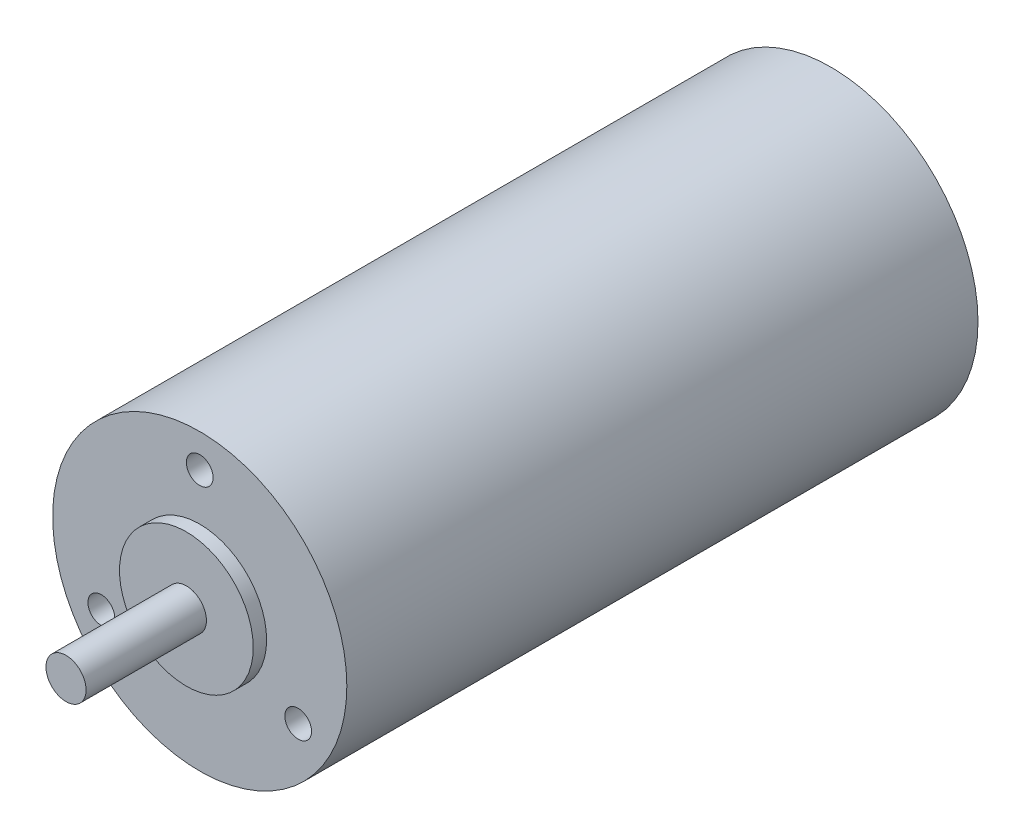
ISO-10303-21;
HEADER;
FILE_DESCRIPTION(('STEP AP214'),'2;1');
FILE_NAME('part.step','',(''),(''),'','','');
FILE_SCHEMA(('AUTOMOTIVE_DESIGN { 1 0 10303 214 1 1 1 1 }'));
ENDSEC;
DATA;
#1=APPLICATION_CONTEXT('core data for automotive mechanical design processes');
#2=APPLICATION_PROTOCOL_DEFINITION('international standard','automotive_design',2000,#1);
#3=PRODUCT_CONTEXT('',#1,'mechanical');
#4=PRODUCT('Part','Part','',(#3));
#5=PRODUCT_RELATED_PRODUCT_CATEGORY('part','',(#4));
#6=PRODUCT_DEFINITION_FORMATION('','',#4);
#7=PRODUCT_DEFINITION_CONTEXT('part definition',#1,'design');
#8=PRODUCT_DEFINITION('design','',#6,#7);
#9=PRODUCT_DEFINITION_SHAPE('','',#8);
#10=(LENGTH_UNIT() NAMED_UNIT(*) SI_UNIT(.MILLI.,.METRE.));
#11=(NAMED_UNIT(*) PLANE_ANGLE_UNIT() SI_UNIT($,.RADIAN.));
#12=(NAMED_UNIT(*) SI_UNIT($,.STERADIAN.) SOLID_ANGLE_UNIT());
#13=UNCERTAINTY_MEASURE_WITH_UNIT(LENGTH_MEASURE(1.E-05),#10,'distance_accuracy_value','');
#14=(GEOMETRIC_REPRESENTATION_CONTEXT(3) GLOBAL_UNCERTAINTY_ASSIGNED_CONTEXT((#13)) GLOBAL_UNIT_ASSIGNED_CONTEXT((#10,
#11,#12)) REPRESENTATION_CONTEXT('',''));
#15=CARTESIAN_POINT('',(0.,0.,0.));
#16=DIRECTION('',(0.,0.,1.));
#17=DIRECTION('',(1.,0.,0.));
#18=AXIS2_PLACEMENT_3D('',#15,#16,#17);
#19=CARTESIAN_POINT('',(0.,0.,-47.2));
#20=DIRECTION('',(0.,0.,1.));
#21=DIRECTION('',(1.,0.,0.));
#22=AXIS2_PLACEMENT_3D('',#19,#20,#21);
#23=CYLINDRICAL_SURFACE('',#22,11.);
#24=CARTESIAN_POINT('',(0.,0.,-47.2));
#25=DIRECTION('',(0.,0.,1.));
#26=DIRECTION('',(1.,0.,0.));
#27=AXIS2_PLACEMENT_3D('',#24,#25,#26);
#28=CIRCLE('',#27,11.);
#29=CARTESIAN_POINT('',(11.,0.,-47.2));
#30=VERTEX_POINT('',#29);
#31=EDGE_CURVE('E51',#30,#30,#28,.T.);
#32=ORIENTED_EDGE('',*,*,#31,.T.);
#33=EDGE_LOOP('',(#32));
#34=FACE_BOUND('',#33,.T.);
#35=CARTESIAN_POINT('',(0.,0.,0.));
#36=DIRECTION('',(0.,0.,1.));
#37=DIRECTION('',(1.,0.,0.));
#38=AXIS2_PLACEMENT_3D('',#35,#36,#37);
#39=CIRCLE('',#38,11.);
#40=CARTESIAN_POINT('',(11.,0.,0.));
#41=VERTEX_POINT('',#40);
#42=EDGE_CURVE('E57',#41,#41,#39,.T.);
#43=ORIENTED_EDGE('',*,*,#42,.F.);
#44=EDGE_LOOP('',(#43));
#45=FACE_BOUND('',#44,.T.);
#46=ADVANCED_FACE('F43',(#34,#45),#23,.T.);
#47=CARTESIAN_POINT('',(0.,0.,-47.2));
#48=DIRECTION('',(0.,0.,1.));
#49=DIRECTION('',(1.,0.,0.));
#50=AXIS2_PLACEMENT_3D('',#47,#48,#49);
#51=PLANE('',#50);
#52=ORIENTED_EDGE('',*,*,#31,.F.);
#53=EDGE_LOOP('',(#52));
#54=FACE_BOUND('',#53,.T.);
#55=ADVANCED_FACE('F111',(#54),#51,.F.);
#56=CARTESIAN_POINT('',(0.,0.,0.));
#57=DIRECTION('',(0.,0.,1.));
#58=DIRECTION('',(1.,0.,0.));
#59=AXIS2_PLACEMENT_3D('',#56,#57,#58);
#60=PLANE('',#59);
#61=CARTESIAN_POINT('',(0.,8.5,0.));
#62=DIRECTION('',(0.,0.,1.));
#63=DIRECTION('',(1.,0.,0.));
#64=AXIS2_PLACEMENT_3D('',#61,#62,#63);
#65=CIRCLE('',#64,1.);
#66=CARTESIAN_POINT('',(1.,8.5,0.));
#67=VERTEX_POINT('',#66);
#68=EDGE_CURVE('E82',#67,#67,#65,.T.);
#69=ORIENTED_EDGE('',*,*,#68,.F.);
#70=EDGE_LOOP('',(#69));
#71=FACE_BOUND('',#70,.T.);
#72=CARTESIAN_POINT('',(7.36121593216805,-4.24999999999982,0.));
#73=DIRECTION('',(0.,0.,1.));
#74=DIRECTION('',(1.,0.,0.));
#75=AXIS2_PLACEMENT_3D('',#72,#73,#74);
#76=CIRCLE('',#75,1.);
#77=CARTESIAN_POINT('',(8.36121593216805,-4.24999999999982,0.));
#78=VERTEX_POINT('',#77);
#79=EDGE_CURVE('E97',#78,#78,#76,.T.);
#80=ORIENTED_EDGE('',*,*,#79,.F.);
#81=EDGE_LOOP('',(#80));
#82=FACE_BOUND('',#81,.T.);
#83=CARTESIAN_POINT('',(-7.36121593216741,-4.25000000000018,0.));
#84=DIRECTION('',(0.,0.,1.));
#85=DIRECTION('',(1.,0.,0.));
#86=AXIS2_PLACEMENT_3D('',#83,#84,#85);
#87=CIRCLE('',#86,1.);
#88=CARTESIAN_POINT('',(-6.36121593216741,-4.25000000000018,0.));
#89=VERTEX_POINT('',#88);
#90=EDGE_CURVE('E89',#89,#89,#87,.T.);
#91=ORIENTED_EDGE('',*,*,#90,.F.);
#92=EDGE_LOOP('',(#91));
#93=FACE_BOUND('',#92,.T.);
#94=CARTESIAN_POINT('',(0.,0.,0.));
#95=DIRECTION('',(0.,0.,1.));
#96=DIRECTION('',(1.,0.,0.));
#97=AXIS2_PLACEMENT_3D('',#94,#95,#96);
#98=CIRCLE('',#97,5.);
#99=CARTESIAN_POINT('',(5.,0.,0.));
#100=VERTEX_POINT('',#99);
#101=EDGE_CURVE('E10',#100,#100,#98,.T.);
#102=ORIENTED_EDGE('',*,*,#101,.F.);
#103=EDGE_LOOP('',(#102));
#104=FACE_BOUND('',#103,.T.);
#105=ORIENTED_EDGE('',*,*,#42,.T.);
#106=EDGE_LOOP('',(#105));
#107=FACE_BOUND('',#106,.T.);
#108=ADVANCED_FACE('F107',(#71,#82,#93,#104,#107),#60,.T.);
#109=CARTESIAN_POINT('',(0.,0.,1.));
#110=DIRECTION('',(0.,0.,-1.));
#111=DIRECTION('',(-1.,0.,0.));
#112=AXIS2_PLACEMENT_3D('',#109,#110,#111);
#113=CYLINDRICAL_SURFACE('',#112,5.);
#114=CARTESIAN_POINT('',(0.,0.,1.));
#115=DIRECTION('',(0.,0.,1.));
#116=DIRECTION('',(1.,0.,0.));
#117=AXIS2_PLACEMENT_3D('',#114,#115,#116);
#118=CIRCLE('',#117,5.);
#119=CARTESIAN_POINT('',(5.,0.,1.));
#120=VERTEX_POINT('',#119);
#121=EDGE_CURVE('E60',#120,#120,#118,.T.);
#122=ORIENTED_EDGE('',*,*,#121,.F.);
#123=EDGE_LOOP('',(#122));
#124=FACE_BOUND('',#123,.T.);
#125=ORIENTED_EDGE('',*,*,#101,.T.);
#126=EDGE_LOOP('',(#125));
#127=FACE_BOUND('',#126,.T.);
#128=ADVANCED_FACE('F110',(#124,#127),#113,.T.);
#129=CARTESIAN_POINT('',(0.,0.,1.));
#130=DIRECTION('',(0.,0.,1.));
#131=DIRECTION('',(1.,0.,0.));
#132=AXIS2_PLACEMENT_3D('',#129,#130,#131);
#133=PLANE('',#132);
#134=CARTESIAN_POINT('',(0.,0.,0.999999999999999));
#135=DIRECTION('',(0.,0.,1.));
#136=DIRECTION('',(1.,0.,0.));
#137=AXIS2_PLACEMENT_3D('',#134,#135,#136);
#138=CIRCLE('',#137,1.5);
#139=CARTESIAN_POINT('',(1.5,0.,0.999999999999999));
#140=VERTEX_POINT('',#139);
#141=EDGE_CURVE('E46',#140,#140,#138,.F.);
#142=ORIENTED_EDGE('',*,*,#141,.T.);
#143=EDGE_LOOP('',(#142));
#144=FACE_BOUND('',#143,.T.);
#145=ORIENTED_EDGE('',*,*,#121,.T.);
#146=EDGE_LOOP('',(#145));
#147=FACE_BOUND('',#146,.T.);
#148=ADVANCED_FACE('F148',(#144,#147),#133,.T.);
#149=CARTESIAN_POINT('',(0.,0.,10.));
#150=DIRECTION('',(0.,0.,-1.));
#151=DIRECTION('',(-1.,0.,0.));
#152=AXIS2_PLACEMENT_3D('',#149,#150,#151);
#153=CYLINDRICAL_SURFACE('',#152,1.5);
#154=ORIENTED_EDGE('',*,*,#141,.F.);
#155=EDGE_LOOP('',(#154));
#156=FACE_BOUND('',#155,.T.);
#157=CARTESIAN_POINT('',(0.,0.,10.));
#158=DIRECTION('',(0.,0.,1.));
#159=DIRECTION('',(1.,0.,0.));
#160=AXIS2_PLACEMENT_3D('',#157,#158,#159);
#161=CIRCLE('',#160,1.5);
#162=CARTESIAN_POINT('',(1.5,0.,10.));
#163=VERTEX_POINT('',#162);
#164=EDGE_CURVE('E72',#163,#163,#161,.T.);
#165=ORIENTED_EDGE('',*,*,#164,.F.);
#166=EDGE_LOOP('',(#165));
#167=FACE_BOUND('',#166,.T.);
#168=ADVANCED_FACE('F130',(#156,#167),#153,.T.);
#169=CARTESIAN_POINT('',(0.,0.,10.));
#170=DIRECTION('',(0.,0.,1.));
#171=DIRECTION('',(1.,0.,0.));
#172=AXIS2_PLACEMENT_3D('',#169,#170,#171);
#173=PLANE('',#172);
#174=ORIENTED_EDGE('',*,*,#164,.T.);
#175=EDGE_LOOP('',(#174));
#176=FACE_BOUND('',#175,.T.);
#177=ADVANCED_FACE('F120',(#176),#173,.T.);
#178=CARTESIAN_POINT('',(-7.36121593216741,-4.25000000000018,-2.5));
#179=DIRECTION('',(0.,0.,1.));
#180=DIRECTION('',(1.,0.,0.));
#181=AXIS2_PLACEMENT_3D('',#178,#179,#180);
#182=CYLINDRICAL_SURFACE('',#181,1.);
#183=CARTESIAN_POINT('',(-7.36121593216741,-4.25000000000018,-2.5));
#184=DIRECTION('',(0.,0.,1.));
#185=DIRECTION('',(1.,0.,0.));
#186=AXIS2_PLACEMENT_3D('',#183,#184,#185);
#187=CIRCLE('',#186,1.);
#188=CARTESIAN_POINT('',(-6.36121593216741,-4.25000000000018,-2.5));
#189=VERTEX_POINT('',#188);
#190=EDGE_CURVE('E85',#189,#189,#187,.T.);
#191=ORIENTED_EDGE('',*,*,#190,.F.);
#192=EDGE_LOOP('',(#191));
#193=FACE_BOUND('',#192,.T.);
#194=ORIENTED_EDGE('',*,*,#90,.T.);
#195=EDGE_LOOP('',(#194));
#196=FACE_BOUND('',#195,.T.);
#197=ADVANCED_FACE('F117',(#193,#196),#182,.F.);
#198=CARTESIAN_POINT('',(-7.36121593216741,-4.25000000000018,-2.5));
#199=DIRECTION('',(0.,0.,1.));
#200=DIRECTION('',(1.,0.,0.));
#201=AXIS2_PLACEMENT_3D('',#198,#199,#200);
#202=PLANE('',#201);
#203=ORIENTED_EDGE('',*,*,#190,.T.);
#204=EDGE_LOOP('',(#203));
#205=FACE_BOUND('',#204,.T.);
#206=ADVANCED_FACE('F119',(#205),#202,.T.);
#207=CARTESIAN_POINT('',(7.36121593216805,-4.24999999999982,-2.5));
#208=DIRECTION('',(0.,0.,1.));
#209=DIRECTION('',(1.,0.,0.));
#210=AXIS2_PLACEMENT_3D('',#207,#208,#209);
#211=CYLINDRICAL_SURFACE('',#210,1.);
#212=CARTESIAN_POINT('',(7.36121593216805,-4.24999999999982,-2.5));
#213=DIRECTION('',(0.,0.,1.));
#214=DIRECTION('',(1.,0.,0.));
#215=AXIS2_PLACEMENT_3D('',#212,#213,#214);
#216=CIRCLE('',#215,1.);
#217=CARTESIAN_POINT('',(8.36121593216805,-4.24999999999982,-2.5));
#218=VERTEX_POINT('',#217);
#219=EDGE_CURVE('E93',#218,#218,#216,.T.);
#220=ORIENTED_EDGE('',*,*,#219,.F.);
#221=EDGE_LOOP('',(#220));
#222=FACE_BOUND('',#221,.T.);
#223=ORIENTED_EDGE('',*,*,#79,.T.);
#224=EDGE_LOOP('',(#223));
#225=FACE_BOUND('',#224,.T.);
#226=ADVANCED_FACE('F126',(#222,#225),#211,.F.);
#227=CARTESIAN_POINT('',(7.36121593216805,-4.24999999999982,-2.5));
#228=DIRECTION('',(0.,0.,1.));
#229=DIRECTION('',(1.,0.,0.));
#230=AXIS2_PLACEMENT_3D('',#227,#228,#229);
#231=PLANE('',#230);
#232=ORIENTED_EDGE('',*,*,#219,.T.);
#233=EDGE_LOOP('',(#232));
#234=FACE_BOUND('',#233,.T.);
#235=ADVANCED_FACE('F202',(#234),#231,.T.);
#236=CARTESIAN_POINT('',(0.,8.5,-2.5));
#237=DIRECTION('',(0.,0.,1.));
#238=DIRECTION('',(1.,0.,0.));
#239=AXIS2_PLACEMENT_3D('',#236,#237,#238);
#240=CYLINDRICAL_SURFACE('',#239,1.);
#241=CARTESIAN_POINT('',(0.,8.5,-2.5));
#242=DIRECTION('',(0.,0.,1.));
#243=DIRECTION('',(1.,0.,0.));
#244=AXIS2_PLACEMENT_3D('',#241,#242,#243);
#245=CIRCLE('',#244,1.);
#246=CARTESIAN_POINT('',(1.,8.5,-2.5));
#247=VERTEX_POINT('',#246);
#248=EDGE_CURVE('E77',#247,#247,#245,.T.);
#249=ORIENTED_EDGE('',*,*,#248,.F.);
#250=EDGE_LOOP('',(#249));
#251=FACE_BOUND('',#250,.T.);
#252=ORIENTED_EDGE('',*,*,#68,.T.);
#253=EDGE_LOOP('',(#252));
#254=FACE_BOUND('',#253,.T.);
#255=ADVANCED_FACE('F105',(#251,#254),#240,.F.);
#256=CARTESIAN_POINT('',(0.,8.5,-2.5));
#257=DIRECTION('',(0.,0.,1.));
#258=DIRECTION('',(1.,0.,0.));
#259=AXIS2_PLACEMENT_3D('',#256,#257,#258);
#260=PLANE('',#259);
#261=ORIENTED_EDGE('',*,*,#248,.T.);
#262=EDGE_LOOP('',(#261));
#263=FACE_BOUND('',#262,.T.);
#264=ADVANCED_FACE('F218',(#263),#260,.T.);
#265=CLOSED_SHELL('',(#46,#55,#108,#128,#148,#168,#177,#197,#206,#226,#235,#255,#264));
#266=MANIFOLD_SOLID_BREP('B2',#265);
#267=ADVANCED_BREP_SHAPE_REPRESENTATION('',(#18,#266),#14);
#268=SHAPE_DEFINITION_REPRESENTATION(#9,#267);
ENDSEC;
END-ISO-10303-21;
